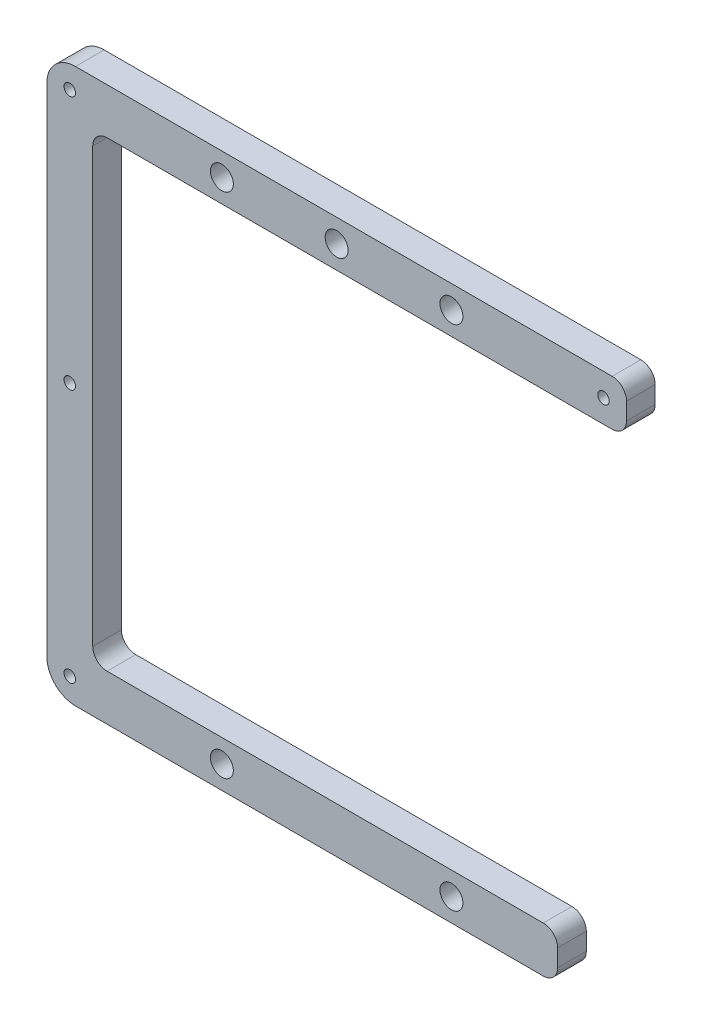
ISO-10303-21;
HEADER;
FILE_DESCRIPTION(('STEP AP214'),'2;1');
FILE_NAME('part.step','',(''),(''),'','','');
FILE_SCHEMA(('AUTOMOTIVE_DESIGN { 1 0 10303 214 1 1 1 1 }'));
ENDSEC;
DATA;
#1=APPLICATION_CONTEXT('core data for automotive mechanical design processes');
#2=APPLICATION_PROTOCOL_DEFINITION('international standard','automotive_design',2000,#1);
#3=PRODUCT_CONTEXT('',#1,'mechanical');
#4=PRODUCT('Part','Part','',(#3));
#5=PRODUCT_RELATED_PRODUCT_CATEGORY('part','',(#4));
#6=PRODUCT_DEFINITION_FORMATION('','',#4);
#7=PRODUCT_DEFINITION_CONTEXT('part definition',#1,'design');
#8=PRODUCT_DEFINITION('design','',#6,#7);
#9=PRODUCT_DEFINITION_SHAPE('','',#8);
#10=(LENGTH_UNIT() NAMED_UNIT(*) SI_UNIT(.MILLI.,.METRE.));
#11=(NAMED_UNIT(*) PLANE_ANGLE_UNIT() SI_UNIT($,.RADIAN.));
#12=(NAMED_UNIT(*) SI_UNIT($,.STERADIAN.) SOLID_ANGLE_UNIT());
#13=UNCERTAINTY_MEASURE_WITH_UNIT(LENGTH_MEASURE(1.E-05),#10,'distance_accuracy_value','');
#14=(GEOMETRIC_REPRESENTATION_CONTEXT(3) GLOBAL_UNCERTAINTY_ASSIGNED_CONTEXT((#13)) GLOBAL_UNIT_ASSIGNED_CONTEXT((#10,
#11,#12)) REPRESENTATION_CONTEXT('',''));
#15=CARTESIAN_POINT('',(0.,0.,0.));
#16=DIRECTION('',(0.,0.,1.));
#17=DIRECTION('',(1.,0.,0.));
#18=AXIS2_PLACEMENT_3D('',#15,#16,#17);
#19=CARTESIAN_POINT('',(5.,-43.25,5.));
#20=DIRECTION('',(0.,0.,-1.));
#21=DIRECTION('',(-1.,0.,0.));
#22=AXIS2_PLACEMENT_3D('',#19,#20,#21);
#23=CYLINDRICAL_SURFACE('',#22,5.);
#24=CARTESIAN_POINT('',(5.,-43.25,0.));
#25=DIRECTION('',(0.,0.,1.));
#26=DIRECTION('',(1.,0.,0.));
#27=AXIS2_PLACEMENT_3D('',#24,#25,#26);
#28=CIRCLE('',#27,5.);
#29=CARTESIAN_POINT('',(0.,-43.25,0.));
#30=VERTEX_POINT('',#29);
#31=CARTESIAN_POINT('',(5.00000000000004,-48.25,0.));
#32=VERTEX_POINT('',#31);
#33=EDGE_CURVE('E181',#30,#32,#28,.T.);
#34=ORIENTED_EDGE('',*,*,#33,.T.);
#35=DIRECTION('',(0.,0.,-1.));
#36=VECTOR('',#35,1.);
#37=CARTESIAN_POINT('',(5.00000000000004,-48.25,5.));
#38=LINE('',#37,#36);
#39=CARTESIAN_POINT('',(5.00000000000004,-48.25,5.));
#40=VERTEX_POINT('',#39);
#41=EDGE_CURVE('E11',#40,#32,#38,.T.);
#42=ORIENTED_EDGE('',*,*,#41,.F.);
#43=CARTESIAN_POINT('',(5.,-43.25,5.));
#44=DIRECTION('',(0.,0.,1.));
#45=DIRECTION('',(1.,0.,0.));
#46=AXIS2_PLACEMENT_3D('',#43,#44,#45);
#47=CIRCLE('',#46,5.);
#48=CARTESIAN_POINT('',(0.,-43.25,5.));
#49=VERTEX_POINT('',#48);
#50=EDGE_CURVE('E212',#49,#40,#47,.T.);
#51=ORIENTED_EDGE('',*,*,#50,.F.);
#52=DIRECTION('',(0.,0.,-1.));
#53=VECTOR('',#52,1.);
#54=CARTESIAN_POINT('',(0.,-43.25,5.));
#55=LINE('',#54,#53);
#56=EDGE_CURVE('E177',#49,#30,#55,.T.);
#57=ORIENTED_EDGE('',*,*,#56,.T.);
#58=EDGE_LOOP('',(#34,#42,#51,#57));
#59=FACE_BOUND('',#58,.T.);
#60=ADVANCED_FACE('F37',(#59),#23,.T.);
#61=CARTESIAN_POINT('',(86.5,-48.25,5.));
#62=DIRECTION('',(0.,1.,0.));
#63=DIRECTION('',(0.,0.,1.));
#64=AXIS2_PLACEMENT_3D('',#61,#62,#63);
#65=PLANE('',#64);
#66=DIRECTION('',(1.,0.,0.));
#67=VECTOR('',#66,1.);
#68=CARTESIAN_POINT('',(86.5,-48.25,0.));
#69=LINE('',#68,#67);
#70=CARTESIAN_POINT('',(86.5,-48.25,0.));
#71=VERTEX_POINT('',#70);
#72=EDGE_CURVE('E184',#32,#71,#69,.T.);
#73=ORIENTED_EDGE('',*,*,#72,.T.);
#74=DIRECTION('',(0.,0.,-1.));
#75=VECTOR('',#74,1.);
#76=CARTESIAN_POINT('',(86.5,-48.25,5.));
#77=LINE('',#76,#75);
#78=CARTESIAN_POINT('',(86.5,-48.25,5.));
#79=VERTEX_POINT('',#78);
#80=EDGE_CURVE('E45',#79,#71,#77,.T.);
#81=ORIENTED_EDGE('',*,*,#80,.F.);
#82=DIRECTION('',(1.,0.,0.));
#83=VECTOR('',#82,1.);
#84=CARTESIAN_POINT('',(86.5,-48.25,5.));
#85=LINE('',#84,#83);
#86=EDGE_CURVE('E120',#40,#79,#85,.T.);
#87=ORIENTED_EDGE('',*,*,#86,.F.);
#88=ORIENTED_EDGE('',*,*,#41,.T.);
#89=EDGE_LOOP('',(#73,#81,#87,#88));
#90=FACE_BOUND('',#89,.T.);
#91=ADVANCED_FACE('F312',(#90),#65,.F.);
#92=CARTESIAN_POINT('',(86.5,-45.75,5.));
#93=DIRECTION('',(0.,0.,-1.));
#94=DIRECTION('',(-1.,0.,0.));
#95=AXIS2_PLACEMENT_3D('',#92,#93,#94);
#96=CYLINDRICAL_SURFACE('',#95,2.5);
#97=CARTESIAN_POINT('',(86.5,-45.75,0.));
#98=DIRECTION('',(0.,0.,1.));
#99=DIRECTION('',(-1.,0.,0.));
#100=AXIS2_PLACEMENT_3D('',#97,#98,#99);
#101=CIRCLE('',#100,2.5);
#102=CARTESIAN_POINT('',(89.,-45.75,0.));
#103=VERTEX_POINT('',#102);
#104=EDGE_CURVE('E187',#71,#103,#101,.T.);
#105=ORIENTED_EDGE('',*,*,#104,.T.);
#106=DIRECTION('',(0.,0.,-1.));
#107=VECTOR('',#106,1.);
#108=CARTESIAN_POINT('',(89.,-45.75,5.));
#109=LINE('',#108,#107);
#110=CARTESIAN_POINT('',(89.,-45.75,5.));
#111=VERTEX_POINT('',#110);
#112=EDGE_CURVE('E243',#111,#103,#109,.T.);
#113=ORIENTED_EDGE('',*,*,#112,.F.);
#114=CARTESIAN_POINT('',(86.5,-45.75,5.));
#115=DIRECTION('',(0.,0.,1.));
#116=DIRECTION('',(-1.,0.,0.));
#117=AXIS2_PLACEMENT_3D('',#114,#115,#116);
#118=CIRCLE('',#117,2.5);
#119=EDGE_CURVE('E251',#79,#111,#118,.T.);
#120=ORIENTED_EDGE('',*,*,#119,.F.);
#121=ORIENTED_EDGE('',*,*,#80,.T.);
#122=EDGE_LOOP('',(#105,#113,#120,#121));
#123=FACE_BOUND('',#122,.T.);
#124=ADVANCED_FACE('F249',(#123),#96,.T.);
#125=CARTESIAN_POINT('',(89.,-42.75,5.));
#126=DIRECTION('',(-1.,0.,0.));
#127=DIRECTION('',(0.,0.,1.));
#128=AXIS2_PLACEMENT_3D('',#125,#126,#127);
#129=PLANE('',#128);
#130=DIRECTION('',(0.,1.,0.));
#131=VECTOR('',#130,1.);
#132=CARTESIAN_POINT('',(89.,-42.75,0.));
#133=LINE('',#132,#131);
#134=CARTESIAN_POINT('',(89.,-42.75,0.));
#135=VERTEX_POINT('',#134);
#136=EDGE_CURVE('E189',#103,#135,#133,.T.);
#137=ORIENTED_EDGE('',*,*,#136,.T.);
#138=DIRECTION('',(0.,0.,-1.));
#139=VECTOR('',#138,1.);
#140=CARTESIAN_POINT('',(89.,-42.75,5.));
#141=LINE('',#140,#139);
#142=CARTESIAN_POINT('',(89.,-42.75,5.));
#143=VERTEX_POINT('',#142);
#144=EDGE_CURVE('E240',#143,#135,#141,.T.);
#145=ORIENTED_EDGE('',*,*,#144,.F.);
#146=DIRECTION('',(0.,1.,0.));
#147=VECTOR('',#146,1.);
#148=CARTESIAN_POINT('',(89.,-42.75,5.));
#149=LINE('',#148,#147);
#150=EDGE_CURVE('E269',#111,#143,#149,.T.);
#151=ORIENTED_EDGE('',*,*,#150,.F.);
#152=ORIENTED_EDGE('',*,*,#112,.T.);
#153=EDGE_LOOP('',(#137,#145,#151,#152));
#154=FACE_BOUND('',#153,.T.);
#155=ADVANCED_FACE('F260',(#154),#129,.F.);
#156=CARTESIAN_POINT('',(86.5,-42.75,5.));
#157=DIRECTION('',(0.,0.,-1.));
#158=DIRECTION('',(-1.,0.,0.));
#159=AXIS2_PLACEMENT_3D('',#156,#157,#158);
#160=CYLINDRICAL_SURFACE('',#159,2.5);
#161=CARTESIAN_POINT('',(86.5,-42.75,0.));
#162=DIRECTION('',(0.,0.,1.));
#163=DIRECTION('',(1.,0.,0.));
#164=AXIS2_PLACEMENT_3D('',#161,#162,#163);
#165=CIRCLE('',#164,2.5);
#166=CARTESIAN_POINT('',(86.5,-40.25,0.));
#167=VERTEX_POINT('',#166);
#168=EDGE_CURVE('E191',#135,#167,#165,.T.);
#169=ORIENTED_EDGE('',*,*,#168,.T.);
#170=DIRECTION('',(0.,0.,-1.));
#171=VECTOR('',#170,1.);
#172=CARTESIAN_POINT('',(86.5,-40.25,5.));
#173=LINE('',#172,#171);
#174=CARTESIAN_POINT('',(86.5,-40.25,5.));
#175=VERTEX_POINT('',#174);
#176=EDGE_CURVE('E237',#175,#167,#173,.T.);
#177=ORIENTED_EDGE('',*,*,#176,.F.);
#178=CARTESIAN_POINT('',(86.5,-42.75,5.));
#179=DIRECTION('',(0.,0.,1.));
#180=DIRECTION('',(1.,0.,0.));
#181=AXIS2_PLACEMENT_3D('',#178,#179,#180);
#182=CIRCLE('',#181,2.5);
#183=EDGE_CURVE('E266',#143,#175,#182,.T.);
#184=ORIENTED_EDGE('',*,*,#183,.F.);
#185=ORIENTED_EDGE('',*,*,#144,.T.);
#186=EDGE_LOOP('',(#169,#177,#184,#185));
#187=FACE_BOUND('',#186,.T.);
#188=ADVANCED_FACE('F264',(#187),#160,.T.);
#189=CARTESIAN_POINT('',(10.5,-40.25,5.));
#190=DIRECTION('',(0.,-1.,0.));
#191=DIRECTION('',(0.,0.,-1.));
#192=AXIS2_PLACEMENT_3D('',#189,#190,#191);
#193=PLANE('',#192);
#194=DIRECTION('',(-1.,0.,0.));
#195=VECTOR('',#194,1.);
#196=CARTESIAN_POINT('',(10.5,-40.25,0.));
#197=LINE('',#196,#195);
#198=CARTESIAN_POINT('',(10.5,-40.25,0.));
#199=VERTEX_POINT('',#198);
#200=EDGE_CURVE('E193',#167,#199,#197,.T.);
#201=ORIENTED_EDGE('',*,*,#200,.T.);
#202=DIRECTION('',(0.,0.,-1.));
#203=VECTOR('',#202,1.);
#204=CARTESIAN_POINT('',(10.5,-40.25,5.));
#205=LINE('',#204,#203);
#206=CARTESIAN_POINT('',(10.5,-40.25,5.));
#207=VERTEX_POINT('',#206);
#208=EDGE_CURVE('E234',#207,#199,#205,.T.);
#209=ORIENTED_EDGE('',*,*,#208,.F.);
#210=DIRECTION('',(-1.,0.,0.));
#211=VECTOR('',#210,1.);
#212=CARTESIAN_POINT('',(10.5,-40.25,5.));
#213=LINE('',#212,#211);
#214=EDGE_CURVE('E268',#175,#207,#213,.T.);
#215=ORIENTED_EDGE('',*,*,#214,.F.);
#216=ORIENTED_EDGE('',*,*,#176,.T.);
#217=EDGE_LOOP('',(#201,#209,#215,#216));
#218=FACE_BOUND('',#217,.T.);
#219=ADVANCED_FACE('F325',(#218),#193,.F.);
#220=CARTESIAN_POINT('',(10.5,-37.75,5.));
#221=DIRECTION('',(0.,0.,-1.));
#222=DIRECTION('',(-1.,0.,0.));
#223=AXIS2_PLACEMENT_3D('',#220,#221,#222);
#224=CYLINDRICAL_SURFACE('',#223,2.5);
#225=CARTESIAN_POINT('',(10.5,-37.75,0.));
#226=DIRECTION('',(0.,0.,-1.));
#227=DIRECTION('',(1.,0.,0.));
#228=AXIS2_PLACEMENT_3D('',#225,#226,#227);
#229=CIRCLE('',#228,2.5);
#230=CARTESIAN_POINT('',(8.00000000000001,-37.75,0.));
#231=VERTEX_POINT('',#230);
#232=EDGE_CURVE('E195',#199,#231,#229,.T.);
#233=ORIENTED_EDGE('',*,*,#232,.T.);
#234=DIRECTION('',(0.,0.,-1.));
#235=VECTOR('',#234,1.);
#236=CARTESIAN_POINT('',(8.00000000000001,-37.75,5.));
#237=LINE('',#236,#235);
#238=CARTESIAN_POINT('',(8.00000000000001,-37.75,5.));
#239=VERTEX_POINT('',#238);
#240=EDGE_CURVE('E231',#239,#231,#237,.T.);
#241=ORIENTED_EDGE('',*,*,#240,.F.);
#242=CARTESIAN_POINT('',(10.5,-37.75,5.));
#243=DIRECTION('',(0.,0.,-1.));
#244=DIRECTION('',(1.,0.,0.));
#245=AXIS2_PLACEMENT_3D('',#242,#243,#244);
#246=CIRCLE('',#245,2.5);
#247=EDGE_CURVE('E271',#207,#239,#246,.T.);
#248=ORIENTED_EDGE('',*,*,#247,.F.);
#249=ORIENTED_EDGE('',*,*,#208,.T.);
#250=EDGE_LOOP('',(#233,#241,#248,#249));
#251=FACE_BOUND('',#250,.T.);
#252=ADVANCED_FACE('F328',(#251),#224,.F.);
#253=CARTESIAN_POINT('',(8.00000000000001,37.75,5.));
#254=DIRECTION('',(-1.,0.,0.));
#255=DIRECTION('',(0.,-1.,0.));
#256=AXIS2_PLACEMENT_3D('',#253,#254,#255);
#257=PLANE('',#256);
#258=DIRECTION('',(0.,1.,0.));
#259=VECTOR('',#258,1.);
#260=CARTESIAN_POINT('',(8.00000000000001,37.75,0.));
#261=LINE('',#260,#259);
#262=CARTESIAN_POINT('',(8.00000000000001,37.75,0.));
#263=VERTEX_POINT('',#262);
#264=EDGE_CURVE('E197',#231,#263,#261,.T.);
#265=ORIENTED_EDGE('',*,*,#264,.T.);
#266=DIRECTION('',(0.,0.,-1.));
#267=VECTOR('',#266,1.);
#268=CARTESIAN_POINT('',(8.00000000000001,37.75,5.));
#269=LINE('',#268,#267);
#270=CARTESIAN_POINT('',(8.00000000000001,37.75,5.));
#271=VERTEX_POINT('',#270);
#272=EDGE_CURVE('E228',#271,#263,#269,.T.);
#273=ORIENTED_EDGE('',*,*,#272,.F.);
#274=DIRECTION('',(0.,1.,0.));
#275=VECTOR('',#274,1.);
#276=CARTESIAN_POINT('',(8.00000000000001,37.75,5.));
#277=LINE('',#276,#275);
#278=EDGE_CURVE('E277',#239,#271,#277,.T.);
#279=ORIENTED_EDGE('',*,*,#278,.F.);
#280=ORIENTED_EDGE('',*,*,#240,.T.);
#281=EDGE_LOOP('',(#265,#273,#279,#280));
#282=FACE_BOUND('',#281,.T.);
#283=ADVANCED_FACE('F332',(#282),#257,.F.);
#284=CARTESIAN_POINT('',(10.5,37.75,5.));
#285=DIRECTION('',(0.,0.,-1.));
#286=DIRECTION('',(-1.,0.,0.));
#287=AXIS2_PLACEMENT_3D('',#284,#285,#286);
#288=CYLINDRICAL_SURFACE('',#287,2.5);
#289=CARTESIAN_POINT('',(10.5,37.75,0.));
#290=DIRECTION('',(0.,0.,-1.));
#291=DIRECTION('',(1.,0.,0.));
#292=AXIS2_PLACEMENT_3D('',#289,#290,#291);
#293=CIRCLE('',#292,2.5);
#294=CARTESIAN_POINT('',(10.5,40.25,0.));
#295=VERTEX_POINT('',#294);
#296=EDGE_CURVE('E199',#263,#295,#293,.T.);
#297=ORIENTED_EDGE('',*,*,#296,.T.);
#298=DIRECTION('',(0.,0.,-1.));
#299=VECTOR('',#298,1.);
#300=CARTESIAN_POINT('',(10.5,40.25,5.));
#301=LINE('',#300,#299);
#302=CARTESIAN_POINT('',(10.5,40.25,5.));
#303=VERTEX_POINT('',#302);
#304=EDGE_CURVE('E225',#303,#295,#301,.T.);
#305=ORIENTED_EDGE('',*,*,#304,.F.);
#306=CARTESIAN_POINT('',(10.5,37.75,5.));
#307=DIRECTION('',(0.,0.,-1.));
#308=DIRECTION('',(1.,0.,0.));
#309=AXIS2_PLACEMENT_3D('',#306,#307,#308);
#310=CIRCLE('',#309,2.5);
#311=EDGE_CURVE('E279',#271,#303,#310,.T.);
#312=ORIENTED_EDGE('',*,*,#311,.F.);
#313=ORIENTED_EDGE('',*,*,#272,.T.);
#314=EDGE_LOOP('',(#297,#305,#312,#313));
#315=FACE_BOUND('',#314,.T.);
#316=ADVANCED_FACE('F336',(#315),#288,.F.);
#317=CARTESIAN_POINT('',(98.5,40.25,5.));
#318=DIRECTION('',(0.,1.,0.));
#319=DIRECTION('',(-1.,0.,0.));
#320=AXIS2_PLACEMENT_3D('',#317,#318,#319);
#321=PLANE('',#320);
#322=DIRECTION('',(1.,0.,0.));
#323=VECTOR('',#322,1.);
#324=CARTESIAN_POINT('',(98.5,40.25,0.));
#325=LINE('',#324,#323);
#326=CARTESIAN_POINT('',(98.5,40.25,0.));
#327=VERTEX_POINT('',#326);
#328=EDGE_CURVE('E201',#295,#327,#325,.T.);
#329=ORIENTED_EDGE('',*,*,#328,.T.);
#330=DIRECTION('',(0.,0.,-1.));
#331=VECTOR('',#330,1.);
#332=CARTESIAN_POINT('',(98.5,40.25,5.));
#333=LINE('',#332,#331);
#334=CARTESIAN_POINT('',(98.5,40.25,5.));
#335=VERTEX_POINT('',#334);
#336=EDGE_CURVE('E222',#335,#327,#333,.T.);
#337=ORIENTED_EDGE('',*,*,#336,.F.);
#338=DIRECTION('',(1.,0.,0.));
#339=VECTOR('',#338,1.);
#340=CARTESIAN_POINT('',(98.5,40.25,5.));
#341=LINE('',#340,#339);
#342=EDGE_CURVE('E281',#303,#335,#341,.T.);
#343=ORIENTED_EDGE('',*,*,#342,.F.);
#344=ORIENTED_EDGE('',*,*,#304,.T.);
#345=EDGE_LOOP('',(#329,#337,#343,#344));
#346=FACE_BOUND('',#345,.T.);
#347=ADVANCED_FACE('F340',(#346),#321,.F.);
#348=CARTESIAN_POINT('',(98.5,42.75,5.));
#349=DIRECTION('',(0.,0.,-1.));
#350=DIRECTION('',(-1.,0.,0.));
#351=AXIS2_PLACEMENT_3D('',#348,#349,#350);
#352=CYLINDRICAL_SURFACE('',#351,2.5);
#353=CARTESIAN_POINT('',(98.5,42.75,0.));
#354=DIRECTION('',(0.,0.,1.));
#355=DIRECTION('',(-1.,0.,0.));
#356=AXIS2_PLACEMENT_3D('',#353,#354,#355);
#357=CIRCLE('',#356,2.5);
#358=CARTESIAN_POINT('',(101.,42.75,0.));
#359=VERTEX_POINT('',#358);
#360=EDGE_CURVE('E203',#327,#359,#357,.T.);
#361=ORIENTED_EDGE('',*,*,#360,.T.);
#362=DIRECTION('',(0.,0.,-1.));
#363=VECTOR('',#362,1.);
#364=CARTESIAN_POINT('',(101.,42.75,5.));
#365=LINE('',#364,#363);
#366=CARTESIAN_POINT('',(101.,42.75,5.));
#367=VERTEX_POINT('',#366);
#368=EDGE_CURVE('E219',#367,#359,#365,.T.);
#369=ORIENTED_EDGE('',*,*,#368,.F.);
#370=CARTESIAN_POINT('',(98.5,42.75,5.));
#371=DIRECTION('',(0.,0.,1.));
#372=DIRECTION('',(-1.,0.,0.));
#373=AXIS2_PLACEMENT_3D('',#370,#371,#372);
#374=CIRCLE('',#373,2.5);
#375=EDGE_CURVE('E283',#335,#367,#374,.T.);
#376=ORIENTED_EDGE('',*,*,#375,.F.);
#377=ORIENTED_EDGE('',*,*,#336,.T.);
#378=EDGE_LOOP('',(#361,#369,#376,#377));
#379=FACE_BOUND('',#378,.T.);
#380=ADVANCED_FACE('F344',(#379),#352,.T.);
#381=CARTESIAN_POINT('',(101.,45.75,5.));
#382=DIRECTION('',(-1.,0.,0.));
#383=DIRECTION('',(0.,0.,1.));
#384=AXIS2_PLACEMENT_3D('',#381,#382,#383);
#385=PLANE('',#384);
#386=DIRECTION('',(0.,1.,0.));
#387=VECTOR('',#386,1.);
#388=CARTESIAN_POINT('',(101.,45.75,0.));
#389=LINE('',#388,#387);
#390=CARTESIAN_POINT('',(101.,45.75,0.));
#391=VERTEX_POINT('',#390);
#392=EDGE_CURVE('E205',#359,#391,#389,.T.);
#393=ORIENTED_EDGE('',*,*,#392,.T.);
#394=DIRECTION('',(0.,0.,-1.));
#395=VECTOR('',#394,1.);
#396=CARTESIAN_POINT('',(101.,45.75,5.));
#397=LINE('',#396,#395);
#398=CARTESIAN_POINT('',(101.,45.75,5.));
#399=VERTEX_POINT('',#398);
#400=EDGE_CURVE('E216',#399,#391,#397,.T.);
#401=ORIENTED_EDGE('',*,*,#400,.F.);
#402=DIRECTION('',(0.,1.,0.));
#403=VECTOR('',#402,1.);
#404=CARTESIAN_POINT('',(101.,45.75,5.));
#405=LINE('',#404,#403);
#406=EDGE_CURVE('E285',#367,#399,#405,.T.);
#407=ORIENTED_EDGE('',*,*,#406,.F.);
#408=ORIENTED_EDGE('',*,*,#368,.T.);
#409=EDGE_LOOP('',(#393,#401,#407,#408));
#410=FACE_BOUND('',#409,.T.);
#411=ADVANCED_FACE('F291',(#410),#385,.F.);
#412=CARTESIAN_POINT('',(98.5,45.75,5.));
#413=DIRECTION('',(0.,0.,-1.));
#414=DIRECTION('',(-1.,0.,0.));
#415=AXIS2_PLACEMENT_3D('',#412,#413,#414);
#416=CYLINDRICAL_SURFACE('',#415,2.5);
#417=CARTESIAN_POINT('',(98.5,45.75,0.));
#418=DIRECTION('',(0.,0.,1.));
#419=DIRECTION('',(-1.,0.,0.));
#420=AXIS2_PLACEMENT_3D('',#417,#418,#419);
#421=CIRCLE('',#420,2.5);
#422=CARTESIAN_POINT('',(98.5,48.25,0.));
#423=VERTEX_POINT('',#422);
#424=EDGE_CURVE('E207',#391,#423,#421,.T.);
#425=ORIENTED_EDGE('',*,*,#424,.T.);
#426=DIRECTION('',(0.,0.,-1.));
#427=VECTOR('',#426,1.);
#428=CARTESIAN_POINT('',(98.5,48.25,5.));
#429=LINE('',#428,#427);
#430=CARTESIAN_POINT('',(98.5,48.25,5.));
#431=VERTEX_POINT('',#430);
#432=EDGE_CURVE('E172',#431,#423,#429,.T.);
#433=ORIENTED_EDGE('',*,*,#432,.F.);
#434=CARTESIAN_POINT('',(98.5,45.75,5.));
#435=DIRECTION('',(0.,0.,1.));
#436=DIRECTION('',(-1.,0.,0.));
#437=AXIS2_PLACEMENT_3D('',#434,#435,#436);
#438=CIRCLE('',#437,2.5);
#439=EDGE_CURVE('E163',#399,#431,#438,.T.);
#440=ORIENTED_EDGE('',*,*,#439,.F.);
#441=ORIENTED_EDGE('',*,*,#400,.T.);
#442=EDGE_LOOP('',(#425,#433,#440,#441));
#443=FACE_BOUND('',#442,.T.);
#444=ADVANCED_FACE('F295',(#443),#416,.T.);
#445=CARTESIAN_POINT('',(5.00000000000002,48.25,5.));
#446=DIRECTION('',(0.,-1.,0.));
#447=DIRECTION('',(1.,0.,0.));
#448=AXIS2_PLACEMENT_3D('',#445,#446,#447);
#449=PLANE('',#448);
#450=DIRECTION('',(-1.,0.,0.));
#451=VECTOR('',#450,1.);
#452=CARTESIAN_POINT('',(5.00000000000002,48.25,0.));
#453=LINE('',#452,#451);
#454=CARTESIAN_POINT('',(5.00000000000002,48.25,0.));
#455=VERTEX_POINT('',#454);
#456=EDGE_CURVE('E171',#423,#455,#453,.T.);
#457=ORIENTED_EDGE('',*,*,#456,.T.);
#458=DIRECTION('',(0.,0.,-1.));
#459=VECTOR('',#458,1.);
#460=CARTESIAN_POINT('',(5.00000000000002,48.25,5.));
#461=LINE('',#460,#459);
#462=CARTESIAN_POINT('',(5.00000000000002,48.25,5.));
#463=VERTEX_POINT('',#462);
#464=EDGE_CURVE('E168',#463,#455,#461,.T.);
#465=ORIENTED_EDGE('',*,*,#464,.F.);
#466=DIRECTION('',(-1.,0.,0.));
#467=VECTOR('',#466,1.);
#468=CARTESIAN_POINT('',(5.00000000000002,48.25,5.));
#469=LINE('',#468,#467);
#470=EDGE_CURVE('E157',#431,#463,#469,.T.);
#471=ORIENTED_EDGE('',*,*,#470,.F.);
#472=ORIENTED_EDGE('',*,*,#432,.T.);
#473=EDGE_LOOP('',(#457,#465,#471,#472));
#474=FACE_BOUND('',#473,.T.);
#475=ADVANCED_FACE('F169',(#474),#449,.F.);
#476=CARTESIAN_POINT('',(4.99999999999999,43.25,5.));
#477=DIRECTION('',(0.,0.,-1.));
#478=DIRECTION('',(-1.,0.,0.));
#479=AXIS2_PLACEMENT_3D('',#476,#477,#478);
#480=CYLINDRICAL_SURFACE('',#479,5.);
#481=CARTESIAN_POINT('',(4.99999999999999,43.25,0.));
#482=DIRECTION('',(0.,0.,1.));
#483=DIRECTION('',(-1.,0.,0.));
#484=AXIS2_PLACEMENT_3D('',#481,#482,#483);
#485=CIRCLE('',#484,5.);
#486=CARTESIAN_POINT('',(0.,43.25,0.));
#487=VERTEX_POINT('',#486);
#488=EDGE_CURVE('E106',#455,#487,#485,.T.);
#489=ORIENTED_EDGE('',*,*,#488,.T.);
#490=DIRECTION('',(0.,0.,-1.));
#491=VECTOR('',#490,1.);
#492=CARTESIAN_POINT('',(0.,43.25,5.));
#493=LINE('',#492,#491);
#494=CARTESIAN_POINT('',(0.,43.25,5.));
#495=VERTEX_POINT('',#494);
#496=EDGE_CURVE('E173',#495,#487,#493,.T.);
#497=ORIENTED_EDGE('',*,*,#496,.F.);
#498=CARTESIAN_POINT('',(4.99999999999999,43.25,5.));
#499=DIRECTION('',(0.,0.,1.));
#500=DIRECTION('',(-1.,0.,0.));
#501=AXIS2_PLACEMENT_3D('',#498,#499,#500);
#502=CIRCLE('',#501,5.);
#503=EDGE_CURVE('E161',#463,#495,#502,.T.);
#504=ORIENTED_EDGE('',*,*,#503,.F.);
#505=ORIENTED_EDGE('',*,*,#464,.T.);
#506=EDGE_LOOP('',(#489,#497,#504,#505));
#507=FACE_BOUND('',#506,.T.);
#508=ADVANCED_FACE('F175',(#507),#480,.T.);
#509=CARTESIAN_POINT('',(0.,-43.25,5.));
#510=DIRECTION('',(1.,0.,0.));
#511=DIRECTION('',(0.,1.,0.));
#512=AXIS2_PLACEMENT_3D('',#509,#510,#511);
#513=PLANE('',#512);
#514=DIRECTION('',(0.,-1.,0.));
#515=VECTOR('',#514,1.);
#516=CARTESIAN_POINT('',(0.,-43.25,0.));
#517=LINE('',#516,#515);
#518=EDGE_CURVE('E112',#487,#30,#517,.T.);
#519=ORIENTED_EDGE('',*,*,#518,.T.);
#520=ORIENTED_EDGE('',*,*,#56,.F.);
#521=DIRECTION('',(0.,-1.,0.));
#522=VECTOR('',#521,1.);
#523=CARTESIAN_POINT('',(0.,-43.25,5.));
#524=LINE('',#523,#522);
#525=EDGE_CURVE('E53',#495,#49,#524,.T.);
#526=ORIENTED_EDGE('',*,*,#525,.F.);
#527=ORIENTED_EDGE('',*,*,#496,.T.);
#528=EDGE_LOOP('',(#519,#520,#526,#527));
#529=FACE_BOUND('',#528,.T.);
#530=ADVANCED_FACE('F299',(#529),#513,.F.);
#531=CARTESIAN_POINT('',(5.,-43.25,5.));
#532=DIRECTION('',(0.,0.,1.));
#533=DIRECTION('',(1.,0.,0.));
#534=AXIS2_PLACEMENT_3D('',#531,#532,#533);
#535=PLANE('',#534);
#536=CARTESIAN_POINT('',(97.,44.25,5.));
#537=DIRECTION('',(0.,0.,1.));
#538=DIRECTION('',(1.,0.,0.));
#539=AXIS2_PLACEMENT_3D('',#536,#537,#538);
#540=CIRCLE('',#539,0.999999999999998);
#541=CARTESIAN_POINT('',(98.,44.25,5.));
#542=VERTEX_POINT('',#541);
#543=EDGE_CURVE('E652',#542,#542,#540,.T.);
#544=ORIENTED_EDGE('',*,*,#543,.F.);
#545=EDGE_LOOP('',(#544));
#546=FACE_BOUND('',#545,.T.);
#547=CARTESIAN_POINT('',(3.99999999999999,44.25,5.));
#548=DIRECTION('',(0.,0.,1.));
#549=DIRECTION('',(1.,0.,0.));
#550=AXIS2_PLACEMENT_3D('',#547,#548,#549);
#551=CIRCLE('',#550,1.);
#552=CARTESIAN_POINT('',(4.99999999999999,44.25,5.));
#553=VERTEX_POINT('',#552);
#554=EDGE_CURVE('E728',#553,#553,#551,.T.);
#555=ORIENTED_EDGE('',*,*,#554,.F.);
#556=EDGE_LOOP('',(#555));
#557=FACE_BOUND('',#556,.T.);
#558=CARTESIAN_POINT('',(4.,-44.25,5.));
#559=DIRECTION('',(0.,0.,1.));
#560=DIRECTION('',(1.,0.,0.));
#561=AXIS2_PLACEMENT_3D('',#558,#559,#560);
#562=CIRCLE('',#561,1.);
#563=CARTESIAN_POINT('',(5.,-44.25,5.));
#564=VERTEX_POINT('',#563);
#565=EDGE_CURVE('E666',#564,#564,#562,.T.);
#566=ORIENTED_EDGE('',*,*,#565,.F.);
#567=EDGE_LOOP('',(#566));
#568=FACE_BOUND('',#567,.T.);
#569=CARTESIAN_POINT('',(4.,0.,5.));
#570=DIRECTION('',(0.,0.,1.));
#571=DIRECTION('',(1.,0.,0.));
#572=AXIS2_PLACEMENT_3D('',#569,#570,#571);
#573=CIRCLE('',#572,1.);
#574=CARTESIAN_POINT('',(5.,0.,5.));
#575=VERTEX_POINT('',#574);
#576=EDGE_CURVE('E663',#575,#575,#573,.T.);
#577=ORIENTED_EDGE('',*,*,#576,.F.);
#578=EDGE_LOOP('',(#577));
#579=FACE_BOUND('',#578,.T.);
#580=CARTESIAN_POINT('',(30.5,44.25,5.));
#581=DIRECTION('',(0.,0.,1.));
#582=DIRECTION('',(1.,0.,0.));
#583=AXIS2_PLACEMENT_3D('',#580,#581,#582);
#584=CIRCLE('',#583,2.00000000000001);
#585=CARTESIAN_POINT('',(32.5,44.25,5.));
#586=VERTEX_POINT('',#585);
#587=EDGE_CURVE('E679',#586,#586,#584,.T.);
#588=ORIENTED_EDGE('',*,*,#587,.F.);
#589=EDGE_LOOP('',(#588));
#590=FACE_BOUND('',#589,.T.);
#591=CARTESIAN_POINT('',(70.5,-44.25,5.));
#592=DIRECTION('',(0.,0.,1.));
#593=DIRECTION('',(-1.,0.,0.));
#594=AXIS2_PLACEMENT_3D('',#591,#592,#593);
#595=CIRCLE('',#594,2.);
#596=CARTESIAN_POINT('',(68.5,-44.25,5.));
#597=VERTEX_POINT('',#596);
#598=EDGE_CURVE('E686',#597,#597,#595,.T.);
#599=ORIENTED_EDGE('',*,*,#598,.F.);
#600=EDGE_LOOP('',(#599));
#601=FACE_BOUND('',#600,.T.);
#602=CARTESIAN_POINT('',(30.5,-44.25,5.));
#603=DIRECTION('',(0.,0.,1.));
#604=DIRECTION('',(-1.,0.,0.));
#605=AXIS2_PLACEMENT_3D('',#602,#603,#604);
#606=CIRCLE('',#605,2.00000000000001);
#607=CARTESIAN_POINT('',(28.5,-44.25,5.));
#608=VERTEX_POINT('',#607);
#609=EDGE_CURVE('E667',#608,#608,#606,.T.);
#610=ORIENTED_EDGE('',*,*,#609,.F.);
#611=EDGE_LOOP('',(#610));
#612=FACE_BOUND('',#611,.T.);
#613=CARTESIAN_POINT('',(50.5,44.25,5.));
#614=DIRECTION('',(0.,0.,1.));
#615=DIRECTION('',(1.,0.,0.));
#616=AXIS2_PLACEMENT_3D('',#613,#614,#615);
#617=CIRCLE('',#616,2.);
#618=CARTESIAN_POINT('',(52.5,44.25,5.));
#619=VERTEX_POINT('',#618);
#620=EDGE_CURVE('E674',#619,#619,#617,.T.);
#621=ORIENTED_EDGE('',*,*,#620,.F.);
#622=EDGE_LOOP('',(#621));
#623=FACE_BOUND('',#622,.T.);
#624=CARTESIAN_POINT('',(70.5,44.25,5.));
#625=DIRECTION('',(0.,0.,1.));
#626=DIRECTION('',(1.,0.,0.));
#627=AXIS2_PLACEMENT_3D('',#624,#625,#626);
#628=CIRCLE('',#627,2.);
#629=CARTESIAN_POINT('',(72.5,44.25,5.));
#630=VERTEX_POINT('',#629);
#631=EDGE_CURVE('E682',#630,#630,#628,.T.);
#632=ORIENTED_EDGE('',*,*,#631,.F.);
#633=EDGE_LOOP('',(#632));
#634=FACE_BOUND('',#633,.T.);
#635=ORIENTED_EDGE('',*,*,#50,.T.);
#636=ORIENTED_EDGE('',*,*,#86,.T.);
#637=ORIENTED_EDGE('',*,*,#119,.T.);
#638=ORIENTED_EDGE('',*,*,#150,.T.);
#639=ORIENTED_EDGE('',*,*,#183,.T.);
#640=ORIENTED_EDGE('',*,*,#214,.T.);
#641=ORIENTED_EDGE('',*,*,#247,.T.);
#642=ORIENTED_EDGE('',*,*,#278,.T.);
#643=ORIENTED_EDGE('',*,*,#311,.T.);
#644=ORIENTED_EDGE('',*,*,#342,.T.);
#645=ORIENTED_EDGE('',*,*,#375,.T.);
#646=ORIENTED_EDGE('',*,*,#406,.T.);
#647=ORIENTED_EDGE('',*,*,#439,.T.);
#648=ORIENTED_EDGE('',*,*,#470,.T.);
#649=ORIENTED_EDGE('',*,*,#503,.T.);
#650=ORIENTED_EDGE('',*,*,#525,.T.);
#651=EDGE_LOOP('',(#635,#636,#637,#638,#639,#640,#641,#642,#643,#644,#645,#646,#647,#648,#649,#650));
#652=FACE_BOUND('',#651,.T.);
#653=ADVANCED_FACE('F159',(#546,#557,#568,#579,#590,#601,#612,#623,#634,#652),#535,.T.);
#654=CARTESIAN_POINT('',(5.,-43.25,0.));
#655=DIRECTION('',(0.,0.,1.));
#656=DIRECTION('',(1.,0.,0.));
#657=AXIS2_PLACEMENT_3D('',#654,#655,#656);
#658=PLANE('',#657);
#659=CARTESIAN_POINT('',(30.5,44.25,0.));
#660=DIRECTION('',(0.,0.,1.));
#661=DIRECTION('',(1.,0.,0.));
#662=AXIS2_PLACEMENT_3D('',#659,#660,#661);
#663=CIRCLE('',#662,2.00000000000001);
#664=CARTESIAN_POINT('',(32.5,44.25,0.));
#665=VERTEX_POINT('',#664);
#666=EDGE_CURVE('E683',#665,#665,#663,.T.);
#667=ORIENTED_EDGE('',*,*,#666,.T.);
#668=EDGE_LOOP('',(#667));
#669=FACE_BOUND('',#668,.T.);
#670=CARTESIAN_POINT('',(70.5,-44.25,0.));
#671=DIRECTION('',(0.,0.,1.));
#672=DIRECTION('',(-1.,0.,0.));
#673=AXIS2_PLACEMENT_3D('',#670,#671,#672);
#674=CIRCLE('',#673,2.);
#675=CARTESIAN_POINT('',(68.5,-44.25,0.));
#676=VERTEX_POINT('',#675);
#677=EDGE_CURVE('E670',#676,#676,#674,.T.);
#678=ORIENTED_EDGE('',*,*,#677,.T.);
#679=EDGE_LOOP('',(#678));
#680=FACE_BOUND('',#679,.T.);
#681=CARTESIAN_POINT('',(30.5,-44.25,0.));
#682=DIRECTION('',(0.,0.,1.));
#683=DIRECTION('',(-1.,0.,0.));
#684=AXIS2_PLACEMENT_3D('',#681,#682,#683);
#685=CIRCLE('',#684,2.00000000000001);
#686=CARTESIAN_POINT('',(28.5,-44.25,0.));
#687=VERTEX_POINT('',#686);
#688=EDGE_CURVE('E671',#687,#687,#685,.T.);
#689=ORIENTED_EDGE('',*,*,#688,.T.);
#690=EDGE_LOOP('',(#689));
#691=FACE_BOUND('',#690,.T.);
#692=CARTESIAN_POINT('',(50.5,44.25,0.));
#693=DIRECTION('',(0.,0.,1.));
#694=DIRECTION('',(1.,0.,0.));
#695=AXIS2_PLACEMENT_3D('',#692,#693,#694);
#696=CIRCLE('',#695,2.);
#697=CARTESIAN_POINT('',(52.5,44.25,0.));
#698=VERTEX_POINT('',#697);
#699=EDGE_CURVE('E662',#698,#698,#696,.T.);
#700=ORIENTED_EDGE('',*,*,#699,.T.);
#701=EDGE_LOOP('',(#700));
#702=FACE_BOUND('',#701,.T.);
#703=CARTESIAN_POINT('',(70.5,44.25,0.));
#704=DIRECTION('',(0.,0.,1.));
#705=DIRECTION('',(1.,0.,0.));
#706=AXIS2_PLACEMENT_3D('',#703,#704,#705);
#707=CIRCLE('',#706,2.);
#708=CARTESIAN_POINT('',(72.5,44.25,0.));
#709=VERTEX_POINT('',#708);
#710=EDGE_CURVE('E185',#709,#709,#707,.T.);
#711=ORIENTED_EDGE('',*,*,#710,.T.);
#712=EDGE_LOOP('',(#711));
#713=FACE_BOUND('',#712,.T.);
#714=ORIENTED_EDGE('',*,*,#33,.F.);
#715=ORIENTED_EDGE('',*,*,#518,.F.);
#716=ORIENTED_EDGE('',*,*,#488,.F.);
#717=ORIENTED_EDGE('',*,*,#456,.F.);
#718=ORIENTED_EDGE('',*,*,#424,.F.);
#719=ORIENTED_EDGE('',*,*,#392,.F.);
#720=ORIENTED_EDGE('',*,*,#360,.F.);
#721=ORIENTED_EDGE('',*,*,#328,.F.);
#722=ORIENTED_EDGE('',*,*,#296,.F.);
#723=ORIENTED_EDGE('',*,*,#264,.F.);
#724=ORIENTED_EDGE('',*,*,#232,.F.);
#725=ORIENTED_EDGE('',*,*,#200,.F.);
#726=ORIENTED_EDGE('',*,*,#168,.F.);
#727=ORIENTED_EDGE('',*,*,#136,.F.);
#728=ORIENTED_EDGE('',*,*,#104,.F.);
#729=ORIENTED_EDGE('',*,*,#72,.F.);
#730=EDGE_LOOP('',(#714,#715,#716,#717,#718,#719,#720,#721,#722,#723,#724,#725,#726,#727,#728,#729));
#731=FACE_BOUND('',#730,.T.);
#732=ADVANCED_FACE('F255',(#669,#680,#691,#702,#713,#731),#658,.F.);
#733=CARTESIAN_POINT('',(70.5,44.25,0.));
#734=DIRECTION('',(0.,0.,1.));
#735=DIRECTION('',(1.,0.,0.));
#736=AXIS2_PLACEMENT_3D('',#733,#734,#735);
#737=CYLINDRICAL_SURFACE('',#736,2.);
#738=ORIENTED_EDGE('',*,*,#710,.F.);
#739=EDGE_LOOP('',(#738));
#740=FACE_BOUND('',#739,.T.);
#741=ORIENTED_EDGE('',*,*,#631,.T.);
#742=EDGE_LOOP('',(#741));
#743=FACE_BOUND('',#742,.T.);
#744=ADVANCED_FACE('F378',(#740,#743),#737,.F.);
#745=CARTESIAN_POINT('',(50.5,44.25,0.));
#746=DIRECTION('',(0.,0.,1.));
#747=DIRECTION('',(1.,0.,0.));
#748=AXIS2_PLACEMENT_3D('',#745,#746,#747);
#749=CYLINDRICAL_SURFACE('',#748,2.);
#750=ORIENTED_EDGE('',*,*,#699,.F.);
#751=EDGE_LOOP('',(#750));
#752=FACE_BOUND('',#751,.T.);
#753=ORIENTED_EDGE('',*,*,#620,.T.);
#754=EDGE_LOOP('',(#753));
#755=FACE_BOUND('',#754,.T.);
#756=ADVANCED_FACE('F388',(#752,#755),#749,.F.);
#757=CARTESIAN_POINT('',(30.5,-44.25,0.));
#758=DIRECTION('',(0.,0.,1.));
#759=DIRECTION('',(1.,0.,0.));
#760=AXIS2_PLACEMENT_3D('',#757,#758,#759);
#761=CYLINDRICAL_SURFACE('',#760,2.00000000000001);
#762=ORIENTED_EDGE('',*,*,#688,.F.);
#763=EDGE_LOOP('',(#762));
#764=FACE_BOUND('',#763,.T.);
#765=ORIENTED_EDGE('',*,*,#609,.T.);
#766=EDGE_LOOP('',(#765));
#767=FACE_BOUND('',#766,.T.);
#768=ADVANCED_FACE('F399',(#764,#767),#761,.F.);
#769=CARTESIAN_POINT('',(70.5,-44.25,0.));
#770=DIRECTION('',(0.,0.,1.));
#771=DIRECTION('',(1.,0.,0.));
#772=AXIS2_PLACEMENT_3D('',#769,#770,#771);
#773=CYLINDRICAL_SURFACE('',#772,2.);
#774=ORIENTED_EDGE('',*,*,#677,.F.);
#775=EDGE_LOOP('',(#774));
#776=FACE_BOUND('',#775,.T.);
#777=ORIENTED_EDGE('',*,*,#598,.T.);
#778=EDGE_LOOP('',(#777));
#779=FACE_BOUND('',#778,.T.);
#780=ADVANCED_FACE('F410',(#776,#779),#773,.F.);
#781=CARTESIAN_POINT('',(30.5,44.25,0.));
#782=DIRECTION('',(0.,0.,1.));
#783=DIRECTION('',(1.,0.,0.));
#784=AXIS2_PLACEMENT_3D('',#781,#782,#783);
#785=CYLINDRICAL_SURFACE('',#784,2.00000000000001);
#786=ORIENTED_EDGE('',*,*,#666,.F.);
#787=EDGE_LOOP('',(#786));
#788=FACE_BOUND('',#787,.T.);
#789=ORIENTED_EDGE('',*,*,#587,.T.);
#790=EDGE_LOOP('',(#789));
#791=FACE_BOUND('',#790,.T.);
#792=ADVANCED_FACE('F421',(#788,#791),#785,.F.);
#793=CARTESIAN_POINT('',(4.,0.,2.));
#794=DIRECTION('',(0.,0.,1.));
#795=DIRECTION('',(1.,0.,0.));
#796=AXIS2_PLACEMENT_3D('',#793,#794,#795);
#797=CYLINDRICAL_SURFACE('',#796,1.);
#798=CARTESIAN_POINT('',(4.,0.,2.));
#799=DIRECTION('',(0.,0.,1.));
#800=DIRECTION('',(1.,0.,0.));
#801=AXIS2_PLACEMENT_3D('',#798,#799,#800);
#802=CIRCLE('',#801,1.);
#803=CARTESIAN_POINT('',(5.,0.,2.));
#804=VERTEX_POINT('',#803);
#805=EDGE_CURVE('E659',#804,#804,#802,.T.);
#806=ORIENTED_EDGE('',*,*,#805,.F.);
#807=EDGE_LOOP('',(#806));
#808=FACE_BOUND('',#807,.T.);
#809=ORIENTED_EDGE('',*,*,#576,.T.);
#810=EDGE_LOOP('',(#809));
#811=FACE_BOUND('',#810,.T.);
#812=ADVANCED_FACE('F431',(#808,#811),#797,.F.);
#813=CARTESIAN_POINT('',(4.,0.,2.));
#814=DIRECTION('',(0.,0.,1.));
#815=DIRECTION('',(1.,0.,0.));
#816=AXIS2_PLACEMENT_3D('',#813,#814,#815);
#817=PLANE('',#816);
#818=ORIENTED_EDGE('',*,*,#805,.T.);
#819=EDGE_LOOP('',(#818));
#820=FACE_BOUND('',#819,.T.);
#821=ADVANCED_FACE('F445',(#820),#817,.T.);
#822=CARTESIAN_POINT('',(4.,-44.25,2.));
#823=DIRECTION('',(0.,0.,1.));
#824=DIRECTION('',(1.,0.,0.));
#825=AXIS2_PLACEMENT_3D('',#822,#823,#824);
#826=CYLINDRICAL_SURFACE('',#825,1.);
#827=CARTESIAN_POINT('',(4.,-44.25,2.));
#828=DIRECTION('',(0.,0.,1.));
#829=DIRECTION('',(1.,0.,0.));
#830=AXIS2_PLACEMENT_3D('',#827,#828,#829);
#831=CIRCLE('',#830,1.);
#832=CARTESIAN_POINT('',(5.,-44.25,2.));
#833=VERTEX_POINT('',#832);
#834=EDGE_CURVE('E723',#833,#833,#831,.T.);
#835=ORIENTED_EDGE('',*,*,#834,.F.);
#836=EDGE_LOOP('',(#835));
#837=FACE_BOUND('',#836,.T.);
#838=ORIENTED_EDGE('',*,*,#565,.T.);
#839=EDGE_LOOP('',(#838));
#840=FACE_BOUND('',#839,.T.);
#841=ADVANCED_FACE('F456',(#837,#840),#826,.F.);
#842=CARTESIAN_POINT('',(4.,-44.25,2.));
#843=DIRECTION('',(0.,0.,1.));
#844=DIRECTION('',(1.,0.,0.));
#845=AXIS2_PLACEMENT_3D('',#842,#843,#844);
#846=PLANE('',#845);
#847=ORIENTED_EDGE('',*,*,#834,.T.);
#848=EDGE_LOOP('',(#847));
#849=FACE_BOUND('',#848,.T.);
#850=ADVANCED_FACE('F467',(#849),#846,.T.);
#851=CARTESIAN_POINT('',(3.99999999999999,44.25,2.));
#852=DIRECTION('',(0.,0.,1.));
#853=DIRECTION('',(1.,0.,0.));
#854=AXIS2_PLACEMENT_3D('',#851,#852,#853);
#855=CYLINDRICAL_SURFACE('',#854,1.);
#856=CARTESIAN_POINT('',(3.99999999999999,44.25,2.));
#857=DIRECTION('',(0.,0.,1.));
#858=DIRECTION('',(1.,0.,0.));
#859=AXIS2_PLACEMENT_3D('',#856,#857,#858);
#860=CIRCLE('',#859,1.);
#861=CARTESIAN_POINT('',(4.99999999999999,44.25,2.));
#862=VERTEX_POINT('',#861);
#863=EDGE_CURVE('E655',#862,#862,#860,.T.);
#864=ORIENTED_EDGE('',*,*,#863,.F.);
#865=EDGE_LOOP('',(#864));
#866=FACE_BOUND('',#865,.T.);
#867=ORIENTED_EDGE('',*,*,#554,.T.);
#868=EDGE_LOOP('',(#867));
#869=FACE_BOUND('',#868,.T.);
#870=ADVANCED_FACE('F478',(#866,#869),#855,.F.);
#871=CARTESIAN_POINT('',(3.99999999999999,44.25,2.));
#872=DIRECTION('',(0.,0.,1.));
#873=DIRECTION('',(1.,0.,0.));
#874=AXIS2_PLACEMENT_3D('',#871,#872,#873);
#875=PLANE('',#874);
#876=ORIENTED_EDGE('',*,*,#863,.T.);
#877=EDGE_LOOP('',(#876));
#878=FACE_BOUND('',#877,.T.);
#879=ADVANCED_FACE('F489',(#878),#875,.T.);
#880=CARTESIAN_POINT('',(97.,44.25,2.));
#881=DIRECTION('',(0.,0.,1.));
#882=DIRECTION('',(1.,0.,0.));
#883=AXIS2_PLACEMENT_3D('',#880,#881,#882);
#884=CYLINDRICAL_SURFACE('',#883,0.999999999999998);
#885=CARTESIAN_POINT('',(97.,44.25,2.));
#886=DIRECTION('',(0.,0.,1.));
#887=DIRECTION('',(1.,0.,0.));
#888=AXIS2_PLACEMENT_3D('',#885,#886,#887);
#889=CIRCLE('',#888,0.999999999999998);
#890=CARTESIAN_POINT('',(98.,44.25,2.));
#891=VERTEX_POINT('',#890);
#892=EDGE_CURVE('E651',#891,#891,#889,.T.);
#893=ORIENTED_EDGE('',*,*,#892,.F.);
#894=EDGE_LOOP('',(#893));
#895=FACE_BOUND('',#894,.T.);
#896=ORIENTED_EDGE('',*,*,#543,.T.);
#897=EDGE_LOOP('',(#896));
#898=FACE_BOUND('',#897,.T.);
#899=ADVANCED_FACE('F500',(#895,#898),#884,.F.);
#900=CARTESIAN_POINT('',(97.,44.25,2.));
#901=DIRECTION('',(0.,0.,1.));
#902=DIRECTION('',(1.,0.,0.));
#903=AXIS2_PLACEMENT_3D('',#900,#901,#902);
#904=PLANE('',#903);
#905=ORIENTED_EDGE('',*,*,#892,.T.);
#906=EDGE_LOOP('',(#905));
#907=FACE_BOUND('',#906,.T.);
#908=ADVANCED_FACE('F511',(#907),#904,.T.);
#909=CLOSED_SHELL('',(#60,#91,#124,#155,#188,#219,#252,#283,#316,#347,#380,#411,#444,#475,#508,
#530,#653,#732,#744,#756,#768,#780,#792,#812,#821,#841,#850,#870,#879,#899,#908));
#910=MANIFOLD_SOLID_BREP('B2',#909);
#911=ADVANCED_BREP_SHAPE_REPRESENTATION('',(#18,#910),#14);
#912=SHAPE_DEFINITION_REPRESENTATION(#9,#911);
ENDSEC;
END-ISO-10303-21;
